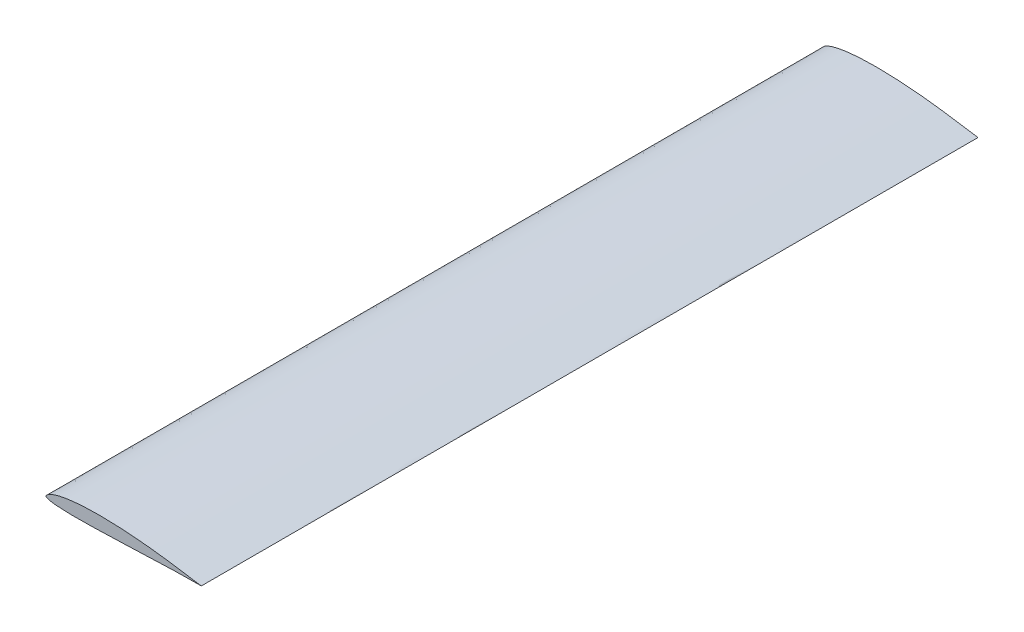
ISO-10303-21;
HEADER;
FILE_DESCRIPTION(('STEP AP214'),'2;1');
FILE_NAME('part.step','',(''),(''),'','','');
FILE_SCHEMA(('AUTOMOTIVE_DESIGN { 1 0 10303 214 1 1 1 1 }'));
ENDSEC;
DATA;
#1=APPLICATION_CONTEXT('core data for automotive mechanical design processes');
#2=APPLICATION_PROTOCOL_DEFINITION('international standard','automotive_design',2000,#1);
#3=PRODUCT_CONTEXT('',#1,'mechanical');
#4=PRODUCT('Part','Part','',(#3));
#5=PRODUCT_RELATED_PRODUCT_CATEGORY('part','',(#4));
#6=PRODUCT_DEFINITION_FORMATION('','',#4);
#7=PRODUCT_DEFINITION_CONTEXT('part definition',#1,'design');
#8=PRODUCT_DEFINITION('design','',#6,#7);
#9=PRODUCT_DEFINITION_SHAPE('','',#8);
#10=(LENGTH_UNIT() NAMED_UNIT(*) SI_UNIT(.MILLI.,.METRE.));
#11=(NAMED_UNIT(*) PLANE_ANGLE_UNIT() SI_UNIT($,.RADIAN.));
#12=(NAMED_UNIT(*) SI_UNIT($,.STERADIAN.) SOLID_ANGLE_UNIT());
#13=UNCERTAINTY_MEASURE_WITH_UNIT(LENGTH_MEASURE(1.E-05),#10,'distance_accuracy_value','');
#14=(GEOMETRIC_REPRESENTATION_CONTEXT(3) GLOBAL_UNCERTAINTY_ASSIGNED_CONTEXT((#13)) GLOBAL_UNIT_ASSIGNED_CONTEXT((#10,
#11,#12)) REPRESENTATION_CONTEXT('',''));
#15=CARTESIAN_POINT('',(0.,0.,0.));
#16=DIRECTION('',(0.,0.,1.));
#17=DIRECTION('',(1.,0.,0.));
#18=AXIS2_PLACEMENT_3D('',#15,#16,#17);
#19=CARTESIAN_POINT('',(50.,0.,250.));
#20=CARTESIAN_POINT('',(50.0001273205321,0.00242279201757395,250.));
#21=CARTESIAN_POINT('',(49.6521840088656,0.0329586213581371,250.));
#22=CARTESIAN_POINT('',(49.3010972078679,0.0831885092802938,250.));
#23=CARTESIAN_POINT('',(48.4592740042575,0.194453497250842,250.));
#24=CARTESIAN_POINT('',(47.4414796455049,0.349875411204893,250.));
#25=CARTESIAN_POINT('',(46.1337766076312,0.554864153763786,250.));
#26=CARTESIAN_POINT('',(44.61548504643,0.799310741550212,250.));
#27=CARTESIAN_POINT('',(42.892312753215,1.07508556042278,250.));
#28=CARTESIAN_POINT('',(40.9957541480389,1.37098043133005,250.));
#29=CARTESIAN_POINT('',(38.9477175297238,1.67466948244018,250.));
#30=CARTESIAN_POINT('',(36.7703229553684,1.97111561609218,250.));
#31=CARTESIAN_POINT('',(34.4838392458463,2.24976134532858,250.));
#32=CARTESIAN_POINT('',(32.1089909863567,2.50484012757015,250.));
#33=CARTESIAN_POINT('',(29.6686085801485,2.73223984273263,250.));
#34=CARTESIAN_POINT('',(27.1889211643221,2.93178234235765,250.));
#35=CARTESIAN_POINT('',(24.6971414763768,3.09962286666098,250.));
#36=CARTESIAN_POINT('',(22.2188171394647,3.22515516799604,250.));
#37=CARTESIAN_POINT('',(19.7784476370654,3.30480069516153,250.));
#38=CARTESIAN_POINT('',(17.399570259008,3.33876730413773,250.));
#39=CARTESIAN_POINT('',(15.1043181791753,3.3209608777707,250.));
#40=CARTESIAN_POINT('',(12.9137731066449,3.24922988713664,250.));
#41=CARTESIAN_POINT('',(10.8475464138471,3.12961914842588,250.));
#42=CARTESIAN_POINT('',(8.92450970637668,2.95957732669919,250.));
#43=CARTESIAN_POINT('',(7.16128784341364,2.74042886608446,250.));
#44=CARTESIAN_POINT('',(5.57151750585493,2.47671453354688,250.));
#45=CARTESIAN_POINT('',(4.16707882987432,2.17390075017167,250.));
#46=CARTESIAN_POINT('',(2.95762695169971,1.83762559037907,250.));
#47=CARTESIAN_POINT('',(1.95046514173136,1.47726345244253,250.));
#48=CARTESIAN_POINT('',(1.1488164731194,1.10304578750434,250.));
#49=CARTESIAN_POINT('',(0.558729346152352,0.731078994339724,250.));
#50=CARTESIAN_POINT('',(0.228075960717646,0.436603357022112,250.));
#51=CARTESIAN_POINT('',(0.0899921707710676,0.239435058265833,250.));
#52=CARTESIAN_POINT('',(0.0408145747667068,0.152213956619051,250.));
#53=CARTESIAN_POINT('',(0.0104498427942053,0.0738270967810475,250.));
#54=CARTESIAN_POINT('',(-0.00154321203104168,0.0120299064321601,250.));
#55=CARTESIAN_POINT('',(0.000871812243820358,-0.0366659130874011,250.));
#56=CARTESIAN_POINT('',(0.024720092378635,-0.0803785419457888,250.));
#57=CARTESIAN_POINT('',(0.0694179091201762,-0.130458815267373,250.));
#58=CARTESIAN_POINT('',(0.14105047094681,-0.188547481064558,250.));
#59=CARTESIAN_POINT('',(0.314418627664273,-0.296228741008699,250.));
#60=CARTESIAN_POINT('',(0.700511343454124,-0.453609622775309,250.));
#61=CARTESIAN_POINT('',(1.37809381395956,-0.628171653606636,250.));
#62=CARTESIAN_POINT('',(2.33745724684421,-0.787734756121067,250.));
#63=CARTESIAN_POINT('',(3.53896744786107,-0.918209354920351,250.));
#64=CARTESIAN_POINT('',(4.97416794497812,-1.01541081628356,250.));
#65=CARTESIAN_POINT('',(6.63120920300308,-1.0793435198751,250.));
#66=CARTESIAN_POINT('',(8.49561044435645,-1.11065446399736,250.));
#67=CARTESIAN_POINT('',(10.5496690235186,-1.11199123142911,250.));
#68=CARTESIAN_POINT('',(12.7727629501113,-1.08678554760908,250.));
#69=CARTESIAN_POINT('',(15.1414405609385,-1.038931401911,250.));
#70=CARTESIAN_POINT('',(17.6298490171543,-0.972256842199377,250.));
#71=CARTESIAN_POINT('',(20.2103380011535,-0.89056470943051,250.));
#72=CARTESIAN_POINT('',(22.8538200474147,-0.797649565655998,250.));
#73=CARTESIAN_POINT('',(25.5302884922338,-0.696923220419977,250.));
#74=CARTESIAN_POINT('',(28.2090611101534,-0.592479052656274,250.));
#75=CARTESIAN_POINT('',(30.8590409643815,-0.487645246314674,250.));
#76=CARTESIAN_POINT('',(33.4489998510024,-0.386619732218495,250.));
#77=CARTESIAN_POINT('',(35.9478419458797,-0.29237673432343,250.));
#78=CARTESIAN_POINT('',(38.3250166377282,-0.208048772804269,250.));
#79=CARTESIAN_POINT('',(40.5510042661914,-0.135849855230422,250.));
#80=CARTESIAN_POINT('',(42.5963952436551,-0.0784780186568451,250.));
#81=CARTESIAN_POINT('',(44.436055181628,-0.0364613008818633,250.));
#82=CARTESIAN_POINT('',(46.0377523753407,-0.00914858105455184,250.));
#83=CARTESIAN_POINT('',(47.3989816954244,0.00431028092650521,250.));
#84=CARTESIAN_POINT('',(48.4440543669687,0.00956179029864694,250.));
#85=CARTESIAN_POINT('',(49.2972475070281,0.00421127418794704,250.));
#86=CARTESIAN_POINT('',(49.6515010884607,0.00898210223244359,250.));
#87=CARTESIAN_POINT('',(49.9998725644973,-0.0024249798023086,250.));
#88=CARTESIAN_POINT('',(50.,0.,250.));
#89=B_SPLINE_CURVE_WITH_KNOTS('',3,(#19,#20,#21,#22,#23,#24,#25,#26,#27,#28,#29,#30,#31,#32,#33,
#34,#35,#36,#37,#38,#39,#40,#41,#42,#43,#44,#45,#46,#47,#48,#49,#50,#51,#52,#53,#54,#55,#56,#57,
#58,#59,#60,#61,#62,#63,#64,#65,#66,#67,#68,#69,#70,#71,#72,#73,#74,#75,#76,#77,#78,#79,#80,#81,
#82,#83,#84,#85,#86,#87,#88),.UNSPECIFIED.,.T.,.F.,(4,1,1,1,1,1,1,1,1,1,1,1,1,1,1,1,1,1,1,1,1,1,
1,1,1,1,1,1,1,1,1,1,1,1,1,1,1,1,1,1,1,1,1,1,1,1,1,1,1,1,1,1,1,1,1,1,1,1,1,1,1,1,1,1,1,1,1,4),
(0.,0.00163100967529279,0.006435235004734,0.0142206692223634,0.0247656252579182,
0.0378267269580913,0.0531493478862453,0.0704735042826113,0.0895356944216796,0.110075427516268,
0.131859874985406,0.154692567294311,0.178371256169875,0.202679511873491,0.22736396068896,
0.252132687183434,0.276728350590027,0.300939435147841,0.324527110506369,0.347267376957691,
0.368991726016915,0.389507470720742,0.408628379551237,0.426224009291417,0.442178727529928,
0.456395551168158,0.4688051239249,0.479372317511659,0.488085518085538,0.494967923813924,
0.500033810265933,0.501035662602399,0.502094489523219,0.502996978480934,0.503512880218242,
0.503955825590444,0.504408894464655,0.504955422997044,0.50594262600694,0.507129613737027,
0.510997734788642,0.518231918904382,0.52784553190147,0.539808758125613,0.554055914736768,
0.570489591502225,0.588973674400973,0.609342058034304,0.631392896979107,0.654894033520888,
0.679589724771299,0.705203145434866,0.731446603653204,0.758020282196595,0.784619627763923,
0.81093562404957,0.836656652810421,0.861473352283136,0.885081474957591,0.90718794410531,
0.927507338219275,0.945765257215092,0.961711873943494,0.975121793215094,0.985796265959578,
0.993581185210361,0.998367517520586,1.),.UNSPECIFIED.);
#90=DIRECTION('',(0.,0.,-1.));
#91=VECTOR('',#90,1.);
#92=SURFACE_OF_LINEAR_EXTRUSION('',#89,#91);
#93=CARTESIAN_POINT('',(50.,0.,250.));
#94=VERTEX_POINT('',#93);
#95=EDGE_CURVE('E10',#94,#94,#89,.T.);
#96=ORIENTED_EDGE('',*,*,#95,.F.);
#97=EDGE_LOOP('',(#96));
#98=FACE_BOUND('',#97,.T.);
#99=CARTESIAN_POINT('',(50.,0.,0.));
#100=CARTESIAN_POINT('',(50.0001273205321,0.00242279201757395,0.));
#101=CARTESIAN_POINT('',(49.6521840088656,0.0329586213581371,0.));
#102=CARTESIAN_POINT('',(49.3010972078679,0.0831885092802938,0.));
#103=CARTESIAN_POINT('',(48.4592740042575,0.194453497250842,0.));
#104=CARTESIAN_POINT('',(47.4414796455049,0.349875411204893,0.));
#105=CARTESIAN_POINT('',(46.1337766076312,0.554864153763786,0.));
#106=CARTESIAN_POINT('',(44.61548504643,0.799310741550212,0.));
#107=CARTESIAN_POINT('',(42.892312753215,1.07508556042278,0.));
#108=CARTESIAN_POINT('',(40.9957541480389,1.37098043133005,0.));
#109=CARTESIAN_POINT('',(38.9477175297238,1.67466948244018,0.));
#110=CARTESIAN_POINT('',(36.7703229553684,1.97111561609218,0.));
#111=CARTESIAN_POINT('',(34.4838392458463,2.24976134532858,0.));
#112=CARTESIAN_POINT('',(32.1089909863567,2.50484012757015,0.));
#113=CARTESIAN_POINT('',(29.6686085801485,2.73223984273263,0.));
#114=CARTESIAN_POINT('',(27.1889211643221,2.93178234235765,0.));
#115=CARTESIAN_POINT('',(24.6971414763768,3.09962286666098,0.));
#116=CARTESIAN_POINT('',(22.2188171394647,3.22515516799604,0.));
#117=CARTESIAN_POINT('',(19.7784476370654,3.30480069516153,0.));
#118=CARTESIAN_POINT('',(17.399570259008,3.33876730413773,0.));
#119=CARTESIAN_POINT('',(15.1043181791753,3.3209608777707,0.));
#120=CARTESIAN_POINT('',(12.9137731066449,3.24922988713664,0.));
#121=CARTESIAN_POINT('',(10.8475464138471,3.12961914842588,0.));
#122=CARTESIAN_POINT('',(8.92450970637668,2.95957732669919,0.));
#123=CARTESIAN_POINT('',(7.16128784341364,2.74042886608446,0.));
#124=CARTESIAN_POINT('',(5.57151750585493,2.47671453354688,0.));
#125=CARTESIAN_POINT('',(4.16707882987432,2.17390075017167,0.));
#126=CARTESIAN_POINT('',(2.95762695169971,1.83762559037907,0.));
#127=CARTESIAN_POINT('',(1.95046514173136,1.47726345244253,0.));
#128=CARTESIAN_POINT('',(1.1488164731194,1.10304578750434,0.));
#129=CARTESIAN_POINT('',(0.558729346152352,0.731078994339724,0.));
#130=CARTESIAN_POINT('',(0.228075960717646,0.436603357022112,0.));
#131=CARTESIAN_POINT('',(0.0899921707710676,0.239435058265833,0.));
#132=CARTESIAN_POINT('',(0.0408145747667068,0.152213956619051,0.));
#133=CARTESIAN_POINT('',(0.0104498427942053,0.0738270967810475,0.));
#134=CARTESIAN_POINT('',(-0.00154321203104168,0.0120299064321601,0.));
#135=CARTESIAN_POINT('',(0.000871812243820358,-0.0366659130874011,0.));
#136=CARTESIAN_POINT('',(0.024720092378635,-0.0803785419457888,0.));
#137=CARTESIAN_POINT('',(0.0694179091201762,-0.130458815267373,0.));
#138=CARTESIAN_POINT('',(0.14105047094681,-0.188547481064558,0.));
#139=CARTESIAN_POINT('',(0.314418627664273,-0.296228741008699,0.));
#140=CARTESIAN_POINT('',(0.700511343454124,-0.453609622775309,0.));
#141=CARTESIAN_POINT('',(1.37809381395956,-0.628171653606636,0.));
#142=CARTESIAN_POINT('',(2.33745724684421,-0.787734756121067,0.));
#143=CARTESIAN_POINT('',(3.53896744786107,-0.918209354920351,0.));
#144=CARTESIAN_POINT('',(4.97416794497812,-1.01541081628356,0.));
#145=CARTESIAN_POINT('',(6.63120920300308,-1.0793435198751,0.));
#146=CARTESIAN_POINT('',(8.49561044435645,-1.11065446399736,0.));
#147=CARTESIAN_POINT('',(10.5496690235186,-1.11199123142911,0.));
#148=CARTESIAN_POINT('',(12.7727629501113,-1.08678554760908,0.));
#149=CARTESIAN_POINT('',(15.1414405609385,-1.038931401911,0.));
#150=CARTESIAN_POINT('',(17.6298490171543,-0.972256842199377,0.));
#151=CARTESIAN_POINT('',(20.2103380011535,-0.89056470943051,0.));
#152=CARTESIAN_POINT('',(22.8538200474147,-0.797649565655998,0.));
#153=CARTESIAN_POINT('',(25.5302884922338,-0.696923220419977,0.));
#154=CARTESIAN_POINT('',(28.2090611101534,-0.592479052656274,0.));
#155=CARTESIAN_POINT('',(30.8590409643815,-0.487645246314674,0.));
#156=CARTESIAN_POINT('',(33.4489998510024,-0.386619732218495,0.));
#157=CARTESIAN_POINT('',(35.9478419458797,-0.29237673432343,0.));
#158=CARTESIAN_POINT('',(38.3250166377282,-0.208048772804269,0.));
#159=CARTESIAN_POINT('',(40.5510042661914,-0.135849855230422,0.));
#160=CARTESIAN_POINT('',(42.5963952436551,-0.0784780186568451,0.));
#161=CARTESIAN_POINT('',(44.436055181628,-0.0364613008818633,0.));
#162=CARTESIAN_POINT('',(46.0377523753407,-0.00914858105455184,0.));
#163=CARTESIAN_POINT('',(47.3989816954244,0.00431028092650521,0.));
#164=CARTESIAN_POINT('',(48.4440543669687,0.00956179029864694,0.));
#165=CARTESIAN_POINT('',(49.2972475070281,0.00421127418794704,0.));
#166=CARTESIAN_POINT('',(49.6515010884607,0.00898210223244359,0.));
#167=CARTESIAN_POINT('',(49.9998725644973,-0.0024249798023086,0.));
#168=CARTESIAN_POINT('',(50.,0.,0.));
#169=B_SPLINE_CURVE_WITH_KNOTS('',3,(#99,#100,#101,#102,#103,#104,#105,#106,#107,#108,#109,#110,
#111,#112,#113,#114,#115,#116,#117,#118,#119,#120,#121,#122,#123,#124,#125,#126,#127,#128,#129,
#130,#131,#132,#133,#134,#135,#136,#137,#138,#139,#140,#141,#142,#143,#144,#145,#146,#147,#148,
#149,#150,#151,#152,#153,#154,#155,#156,#157,#158,#159,#160,#161,#162,#163,#164,#165,#166,#167,
#168),.UNSPECIFIED.,.T.,.F.,(4,1,1,1,1,1,1,1,1,1,1,1,1,1,1,1,1,1,1,1,1,1,1,1,1,1,1,1,1,1,1,1,1,
1,1,1,1,1,1,1,1,1,1,1,1,1,1,1,1,1,1,1,1,1,1,1,1,1,1,1,1,1,1,1,1,1,1,4),(0.,0.00163100967529279,
0.006435235004734,0.0142206692223634,0.0247656252579182,0.0378267269580913,0.0531493478862453,
0.0704735042826113,0.0895356944216796,0.110075427516268,0.131859874985406,0.154692567294311,
0.178371256169875,0.202679511873491,0.22736396068896,0.252132687183434,0.276728350590027,
0.300939435147841,0.324527110506369,0.347267376957691,0.368991726016915,0.389507470720742,
0.408628379551237,0.426224009291417,0.442178727529928,0.456395551168158,0.4688051239249,
0.479372317511659,0.488085518085538,0.494967923813924,0.500033810265933,0.501035662602399,
0.502094489523219,0.502996978480934,0.503512880218242,0.503955825590444,0.504408894464655,
0.504955422997044,0.50594262600694,0.507129613737027,0.510997734788642,0.518231918904382,
0.52784553190147,0.539808758125613,0.554055914736768,0.570489591502225,0.588973674400973,
0.609342058034304,0.631392896979107,0.654894033520888,0.679589724771299,0.705203145434866,
0.731446603653204,0.758020282196595,0.784619627763923,0.81093562404957,0.836656652810421,
0.861473352283136,0.885081474957591,0.90718794410531,0.927507338219275,0.945765257215092,
0.961711873943494,0.975121793215094,0.985796265959578,0.993581185210361,0.998367517520586,1.),.UNSPECIFIED.);
#170=CARTESIAN_POINT('',(50.,0.,0.));
#171=VERTEX_POINT('',#170);
#172=EDGE_CURVE('E41',#171,#171,#169,.T.);
#173=ORIENTED_EDGE('',*,*,#172,.T.);
#174=EDGE_LOOP('',(#173));
#175=FACE_BOUND('',#174,.T.);
#176=ADVANCED_FACE('F37',(#98,#175),#92,.F.);
#177=CARTESIAN_POINT('',(0.152421900745486,0.326070947575085,250.));
#178=DIRECTION('',(0.,0.,-1.));
#179=DIRECTION('',(-1.,0.,0.));
#180=AXIS2_PLACEMENT_3D('',#177,#178,#179);
#181=PLANE('',#180);
#182=ORIENTED_EDGE('',*,*,#95,.T.);
#183=EDGE_LOOP('',(#182));
#184=FACE_BOUND('',#183,.T.);
#185=ADVANCED_FACE('F62',(#184),#181,.F.);
#186=CARTESIAN_POINT('',(0.152421900745486,0.326070947575085,0.));
#187=DIRECTION('',(0.,0.,-1.));
#188=DIRECTION('',(-1.,0.,0.));
#189=AXIS2_PLACEMENT_3D('',#186,#187,#188);
#190=PLANE('',#189);
#191=ORIENTED_EDGE('',*,*,#172,.F.);
#192=EDGE_LOOP('',(#191));
#193=FACE_BOUND('',#192,.T.);
#194=ADVANCED_FACE('F60',(#193),#190,.T.);
#195=CLOSED_SHELL('',(#176,#185,#194));
#196=MANIFOLD_SOLID_BREP('B2',#195);
#197=ADVANCED_BREP_SHAPE_REPRESENTATION('',(#18,#196),#14);
#198=SHAPE_DEFINITION_REPRESENTATION(#9,#197);
ENDSEC;
END-ISO-10303-21;
